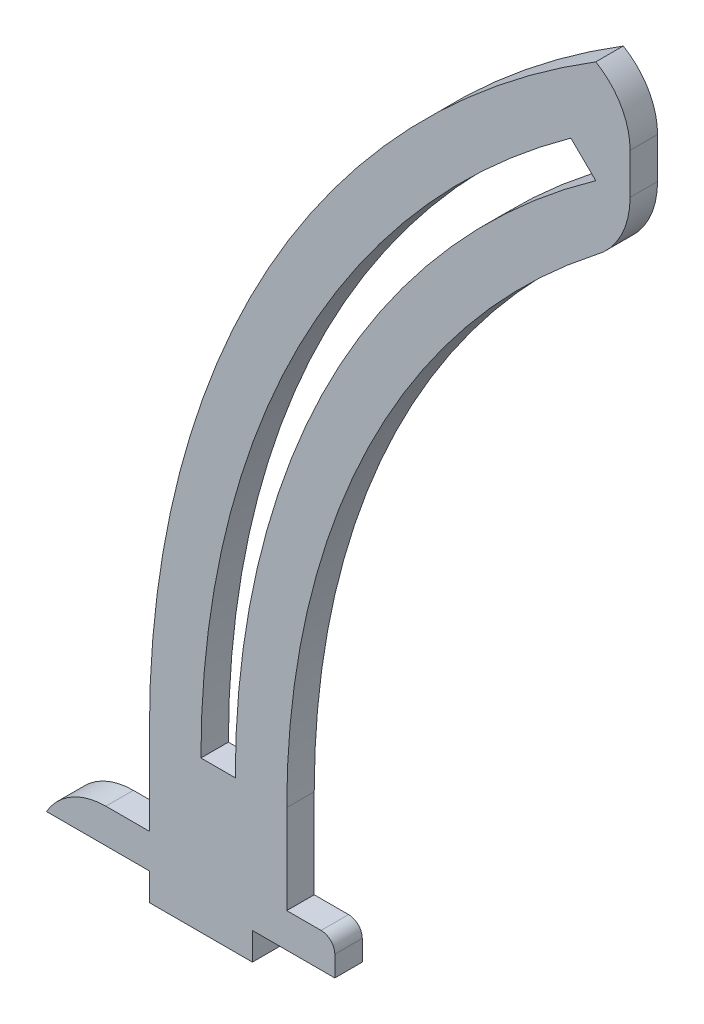
ISO-10303-21;
HEADER;
FILE_DESCRIPTION(('STEP AP214'),'2;1');
FILE_NAME('part.step','',(''),(''),'','','');
FILE_SCHEMA(('AUTOMOTIVE_DESIGN { 1 0 10303 214 1 1 1 1 }'));
ENDSEC;
DATA;
#1=APPLICATION_CONTEXT('core data for automotive mechanical design processes');
#2=APPLICATION_PROTOCOL_DEFINITION('international standard','automotive_design',2000,#1);
#3=PRODUCT_CONTEXT('',#1,'mechanical');
#4=PRODUCT('Part','Part','',(#3));
#5=PRODUCT_RELATED_PRODUCT_CATEGORY('part','',(#4));
#6=PRODUCT_DEFINITION_FORMATION('','',#4);
#7=PRODUCT_DEFINITION_CONTEXT('part definition',#1,'design');
#8=PRODUCT_DEFINITION('design','',#6,#7);
#9=PRODUCT_DEFINITION_SHAPE('','',#8);
#10=(LENGTH_UNIT() NAMED_UNIT(*) SI_UNIT(.MILLI.,.METRE.));
#11=(NAMED_UNIT(*) PLANE_ANGLE_UNIT() SI_UNIT($,.RADIAN.));
#12=(NAMED_UNIT(*) SI_UNIT($,.STERADIAN.) SOLID_ANGLE_UNIT());
#13=UNCERTAINTY_MEASURE_WITH_UNIT(LENGTH_MEASURE(1.E-05),#10,'distance_accuracy_value','');
#14=(GEOMETRIC_REPRESENTATION_CONTEXT(3) GLOBAL_UNCERTAINTY_ASSIGNED_CONTEXT((#13)) GLOBAL_UNIT_ASSIGNED_CONTEXT((#10,
#11,#12)) REPRESENTATION_CONTEXT('',''));
#15=CARTESIAN_POINT('',(0.,0.,0.));
#16=DIRECTION('',(0.,0.,1.));
#17=DIRECTION('',(1.,0.,0.));
#18=AXIS2_PLACEMENT_3D('',#15,#16,#17);
#19=CARTESIAN_POINT('',(0.,-22.86,0.));
#20=DIRECTION('',(0.,-1.,0.));
#21=DIRECTION('',(1.,0.,0.));
#22=AXIS2_PLACEMENT_3D('',#19,#20,#21);
#23=PLANE('',#22);
#24=DIRECTION('',(1.,0.,0.));
#25=VECTOR('',#24,1.);
#26=CARTESIAN_POINT('',(-173.99,-22.8600000000001,0.));
#27=LINE('',#26,#25);
#28=CARTESIAN_POINT('',(-193.04,-22.8600000000001,0.));
#29=VERTEX_POINT('',#28);
#30=CARTESIAN_POINT('',(-173.99,-22.8600000000001,0.));
#31=VERTEX_POINT('',#30);
#32=EDGE_CURVE('E263',#29,#31,#27,.T.);
#33=ORIENTED_EDGE('',*,*,#32,.T.);
#34=DIRECTION('',(0.,0.,-1.));
#35=VECTOR('',#34,1.);
#36=CARTESIAN_POINT('',(-173.99,-22.8600000000001,0.));
#37=LINE('',#36,#35);
#38=CARTESIAN_POINT('',(-173.99,-22.8600000000001,5.08));
#39=VERTEX_POINT('',#38);
#40=EDGE_CURVE('E197',#39,#31,#37,.T.);
#41=ORIENTED_EDGE('',*,*,#40,.F.);
#42=DIRECTION('',(-1.,0.,0.));
#43=VECTOR('',#42,1.);
#44=CARTESIAN_POINT('',(-173.99,-22.8600000000001,5.08));
#45=LINE('',#44,#43);
#46=CARTESIAN_POINT('',(-193.04,-22.8600000000001,5.08));
#47=VERTEX_POINT('',#46);
#48=EDGE_CURVE('E265',#39,#47,#45,.T.);
#49=ORIENTED_EDGE('',*,*,#48,.T.);
#50=DIRECTION('',(0.,0.,1.));
#51=VECTOR('',#50,1.);
#52=CARTESIAN_POINT('',(-193.04,-22.8600000000001,0.));
#53=LINE('',#52,#51);
#54=EDGE_CURVE('E229',#29,#47,#53,.T.);
#55=ORIENTED_EDGE('',*,*,#54,.F.);
#56=EDGE_LOOP('',(#33,#41,#49,#55));
#57=FACE_BOUND('',#56,.T.);
#58=ADVANCED_FACE('F32',(#57),#23,.T.);
#59=CARTESIAN_POINT('',(0.,0.,5.08));
#60=DIRECTION('',(0.,0.,-1.));
#61=DIRECTION('',(-1.,0.,0.));
#62=AXIS2_PLACEMENT_3D('',#59,#60,#61);
#63=CYLINDRICAL_SURFACE('',#62,173.99);
#64=CARTESIAN_POINT('',(0.,0.,5.08));
#65=DIRECTION('',(0.,0.,-1.));
#66=DIRECTION('',(-1.,0.,0.));
#67=AXIS2_PLACEMENT_3D('',#64,#65,#66);
#68=CIRCLE('',#67,173.99);
#69=CARTESIAN_POINT('',(-173.99,0.,5.08));
#70=VERTEX_POINT('',#69);
#71=CARTESIAN_POINT('',(-91.4322400010832,148.029272741523,5.08));
#72=VERTEX_POINT('',#71);
#73=EDGE_CURVE('E291',#70,#72,#68,.T.);
#74=ORIENTED_EDGE('',*,*,#73,.T.);
#75=DIRECTION('',(0.,0.,-1.));
#76=VECTOR('',#75,1.);
#77=CARTESIAN_POINT('',(-91.4322400010832,148.029272741523,5.08));
#78=LINE('',#77,#76);
#79=CARTESIAN_POINT('',(-91.4322400010832,148.029272741523,0.));
#80=VERTEX_POINT('',#79);
#81=EDGE_CURVE('E217',#72,#80,#78,.T.);
#82=ORIENTED_EDGE('',*,*,#81,.T.);
#83=CARTESIAN_POINT('',(0.,0.,0.));
#84=DIRECTION('',(0.,0.,-1.));
#85=DIRECTION('',(-1.,0.,0.));
#86=AXIS2_PLACEMENT_3D('',#83,#84,#85);
#87=CIRCLE('',#86,173.99);
#88=CARTESIAN_POINT('',(-173.99,0.,0.));
#89=VERTEX_POINT('',#88);
#90=EDGE_CURVE('E295',#89,#80,#87,.T.);
#91=ORIENTED_EDGE('',*,*,#90,.F.);
#92=DIRECTION('',(0.,0.,-1.));
#93=VECTOR('',#92,1.);
#94=CARTESIAN_POINT('',(-173.99,0.,5.08));
#95=LINE('',#94,#93);
#96=EDGE_CURVE('E294',#70,#89,#95,.T.);
#97=ORIENTED_EDGE('',*,*,#96,.F.);
#98=EDGE_LOOP('',(#74,#82,#91,#97));
#99=FACE_BOUND('',#98,.T.);
#100=ADVANCED_FACE('F370',(#99),#63,.T.);
#101=CARTESIAN_POINT('',(0.,0.,5.08));
#102=DIRECTION('',(0.,0.,1.));
#103=DIRECTION('',(1.,0.,0.));
#104=AXIS2_PLACEMENT_3D('',#101,#102,#103);
#105=PLANE('',#104);
#106=ORIENTED_EDGE('',*,*,#48,.F.);
#107=DIRECTION('',(0.,1.,0.));
#108=VECTOR('',#107,1.);
#109=CARTESIAN_POINT('',(-173.99,-27.9400000000001,5.08));
#110=LINE('',#109,#108);
#111=CARTESIAN_POINT('',(-173.99,-27.9400000000001,5.08));
#112=VERTEX_POINT('',#111);
#113=EDGE_CURVE('E193',#112,#39,#110,.T.);
#114=ORIENTED_EDGE('',*,*,#113,.F.);
#115=DIRECTION('',(-1.,0.,0.));
#116=VECTOR('',#115,1.);
#117=CARTESIAN_POINT('',(-167.64,-27.9400000000001,5.08));
#118=LINE('',#117,#116);
#119=CARTESIAN_POINT('',(-154.94,-27.9400000000001,5.08));
#120=VERTEX_POINT('',#119);
#121=EDGE_CURVE('E186',#120,#112,#118,.T.);
#122=ORIENTED_EDGE('',*,*,#121,.F.);
#123=DIRECTION('',(0.,1.,0.));
#124=VECTOR('',#123,1.);
#125=CARTESIAN_POINT('',(-154.94,-27.9400000000001,5.08));
#126=LINE('',#125,#124);
#127=CARTESIAN_POINT('',(-154.94,-22.8600000000001,5.08));
#128=VERTEX_POINT('',#127);
#129=EDGE_CURVE('E226',#120,#128,#126,.T.);
#130=ORIENTED_EDGE('',*,*,#129,.T.);
#131=CARTESIAN_POINT('',(-139.7,-22.8600000000001,5.08));
#132=VERTEX_POINT('',#131);
#133=EDGE_CURVE('E267',#132,#128,#45,.T.);
#134=ORIENTED_EDGE('',*,*,#133,.F.);
#135=DIRECTION('',(0.,1.,0.));
#136=VECTOR('',#135,1.);
#137=CARTESIAN_POINT('',(-139.7,-22.8600000000001,5.08));
#138=LINE('',#137,#136);
#139=CARTESIAN_POINT('',(-139.7,-19.0500000000001,5.08));
#140=VERTEX_POINT('',#139);
#141=EDGE_CURVE('E237',#132,#140,#138,.T.);
#142=ORIENTED_EDGE('',*,*,#141,.T.);
#143=CARTESIAN_POINT('',(-142.24,-19.0500000000001,5.08));
#144=DIRECTION('',(0.,0.,1.));
#145=DIRECTION('',(1.,0.,0.));
#146=AXIS2_PLACEMENT_3D('',#143,#144,#145);
#147=CIRCLE('',#146,2.54);
#148=CARTESIAN_POINT('',(-142.24,-16.5100000000001,5.08));
#149=VERTEX_POINT('',#148);
#150=EDGE_CURVE('E11',#140,#149,#147,.T.);
#151=ORIENTED_EDGE('',*,*,#150,.T.);
#152=DIRECTION('',(-1.,0.,0.));
#153=VECTOR('',#152,1.);
#154=CARTESIAN_POINT('',(-139.7,-16.5100000000001,5.08));
#155=LINE('',#154,#153);
#156=CARTESIAN_POINT('',(-148.59,-16.5100000000001,5.08));
#157=VERTEX_POINT('',#156);
#158=EDGE_CURVE('E244',#149,#157,#155,.T.);
#159=ORIENTED_EDGE('',*,*,#158,.T.);
#160=DIRECTION('',(0.,1.,0.));
#161=VECTOR('',#160,1.);
#162=CARTESIAN_POINT('',(-148.59,-22.8600000000001,5.08));
#163=LINE('',#162,#161);
#164=CARTESIAN_POINT('',(-148.59,-1.06452606712904E-13,5.08));
#165=VERTEX_POINT('',#164);
#166=EDGE_CURVE('E278',#157,#165,#163,.T.);
#167=ORIENTED_EDGE('',*,*,#166,.T.);
#168=CARTESIAN_POINT('',(0.,0.,5.08));
#169=DIRECTION('',(0.,0.,1.));
#170=DIRECTION('',(1.,0.,0.));
#171=AXIS2_PLACEMENT_3D('',#168,#169,#170);
#172=CIRCLE('',#171,148.59);
#173=CARTESIAN_POINT('',(-91.4322400010832,117.128705227986,5.08));
#174=VERTEX_POINT('',#173);
#175=EDGE_CURVE('E251',#165,#174,#172,.F.);
#176=ORIENTED_EDGE('',*,*,#175,.T.);
#177=CARTESIAN_POINT('',(-100.322240001083,129.507134045893,5.08));
#178=DIRECTION('',(0.,0.,1.));
#179=DIRECTION('',(1.,0.,0.));
#180=AXIS2_PLACEMENT_3D('',#177,#178,#179);
#181=CIRCLE('',#180,15.24);
#182=CARTESIAN_POINT('',(-85.0822400010832,129.507134045893,5.08));
#183=VERTEX_POINT('',#182);
#184=EDGE_CURVE('E312',#174,#183,#181,.T.);
#185=ORIENTED_EDGE('',*,*,#184,.T.);
#186=DIRECTION('',(0.,-1.,0.));
#187=VECTOR('',#186,1.);
#188=CARTESIAN_POINT('',(-85.0822400010832,148.029272741523,5.08));
#189=LINE('',#188,#187);
#190=CARTESIAN_POINT('',(-85.0822400010832,137.030750113461,5.08));
#191=VERTEX_POINT('',#190);
#192=EDGE_CURVE('E209',#191,#183,#189,.T.);
#193=ORIENTED_EDGE('',*,*,#192,.F.);
#194=CARTESIAN_POINT('',(-97.7822400010832,137.030750113461,5.08));
#195=DIRECTION('',(0.,0.,1.));
#196=DIRECTION('',(1.,0.,0.));
#197=AXIS2_PLACEMENT_3D('',#194,#195,#196);
#198=CIRCLE('',#197,12.7);
#199=EDGE_CURVE('E318',#191,#72,#198,.T.);
#200=ORIENTED_EDGE('',*,*,#199,.T.);
#201=ORIENTED_EDGE('',*,*,#73,.F.);
#202=DIRECTION('',(0.,1.,0.));
#203=VECTOR('',#202,1.);
#204=CARTESIAN_POINT('',(-173.99,-22.8600000000001,5.08));
#205=LINE('',#204,#203);
#206=CARTESIAN_POINT('',(-173.99,-16.5100000000001,5.08));
#207=VERTEX_POINT('',#206);
#208=EDGE_CURVE('E269',#207,#70,#205,.T.);
#209=ORIENTED_EDGE('',*,*,#208,.F.);
#210=CARTESIAN_POINT('',(-182.041477371938,-16.5100000000001,5.08));
#211=VERTEX_POINT('',#210);
#212=EDGE_CURVE('E239',#207,#211,#155,.T.);
#213=ORIENTED_EDGE('',*,*,#212,.T.);
#214=CARTESIAN_POINT('',(-182.041477371938,-29.2100000000001,5.08));
#215=DIRECTION('',(0.,0.,1.));
#216=DIRECTION('',(1.,0.,0.));
#217=AXIS2_PLACEMENT_3D('',#214,#215,#216);
#218=CIRCLE('',#217,12.7);
#219=EDGE_CURVE('E326',#211,#47,#218,.T.);
#220=ORIENTED_EDGE('',*,*,#219,.T.);
#221=EDGE_LOOP('',(#106,#114,#122,#130,#134,#142,#151,#159,#167,#176,#185,#193,#200,#201,#209,
#213,#220));
#222=FACE_BOUND('',#221,.T.);
#223=DIRECTION('',(-0.714798052741385,0.699330925812039,0.));
#224=VECTOR('',#223,1.);
#225=CARTESIAN_POINT('',(-91.4322400010832,128.998057013989,5.08));
#226=LINE('',#225,#224);
#227=CARTESIAN_POINT('',(-91.4322400010832,128.998057013989,5.08));
#228=VERTEX_POINT('',#227);
#229=CARTESIAN_POINT('',(-96.0425867651607,133.508642987848,5.08));
#230=VERTEX_POINT('',#229);
#231=EDGE_CURVE('E203',#228,#230,#226,.T.);
#232=ORIENTED_EDGE('',*,*,#231,.F.);
#233=CARTESIAN_POINT('',(0.,0.,5.08));
#234=DIRECTION('',(0.,0.,1.));
#235=DIRECTION('',(1.,0.,0.));
#236=AXIS2_PLACEMENT_3D('',#233,#234,#235);
#237=CIRCLE('',#236,158.115);
#238=CARTESIAN_POINT('',(-158.115,0.,5.08));
#239=VERTEX_POINT('',#238);
#240=EDGE_CURVE('E258',#239,#228,#237,.F.);
#241=ORIENTED_EDGE('',*,*,#240,.F.);
#242=DIRECTION('',(-1.,0.,0.));
#243=VECTOR('',#242,1.);
#244=CARTESIAN_POINT('',(-173.99,-1.24649633501434E-13,5.08));
#245=LINE('',#244,#243);
#246=CARTESIAN_POINT('',(-164.465,-1.17825748455735E-13,5.08));
#247=VERTEX_POINT('',#246);
#248=EDGE_CURVE('E275',#239,#247,#245,.T.);
#249=ORIENTED_EDGE('',*,*,#248,.T.);
#250=CARTESIAN_POINT('',(0.,0.,5.08));
#251=DIRECTION('',(0.,0.,1.));
#252=DIRECTION('',(1.,0.,0.));
#253=AXIS2_PLACEMENT_3D('',#250,#251,#252);
#254=CIRCLE('',#253,164.465);
#255=EDGE_CURVE('E290',#247,#230,#254,.F.);
#256=ORIENTED_EDGE('',*,*,#255,.T.);
#257=EDGE_LOOP('',(#232,#241,#249,#256));
#258=FACE_BOUND('',#257,.T.);
#259=ADVANCED_FACE('F351',(#222,#258),#105,.T.);
#260=CARTESIAN_POINT('',(0.,0.,0.));
#261=DIRECTION('',(0.,0.,1.));
#262=DIRECTION('',(1.,0.,0.));
#263=AXIS2_PLACEMENT_3D('',#260,#261,#262);
#264=PLANE('',#263);
#265=CARTESIAN_POINT('',(0.,0.,0.));
#266=DIRECTION('',(0.,0.,1.));
#267=DIRECTION('',(1.,0.,0.));
#268=AXIS2_PLACEMENT_3D('',#265,#266,#267);
#269=CIRCLE('',#268,158.115);
#270=CARTESIAN_POINT('',(-158.115,0.,0.));
#271=VERTEX_POINT('',#270);
#272=CARTESIAN_POINT('',(-91.4322400010832,128.998057013989,0.));
#273=VERTEX_POINT('',#272);
#274=EDGE_CURVE('E254',#271,#273,#269,.F.);
#275=ORIENTED_EDGE('',*,*,#274,.T.);
#276=DIRECTION('',(-0.714798052741385,0.699330925812039,0.));
#277=VECTOR('',#276,1.);
#278=CARTESIAN_POINT('',(-91.4322400010832,128.998057013989,0.));
#279=LINE('',#278,#277);
#280=CARTESIAN_POINT('',(-96.0425867651607,133.508642987848,0.));
#281=VERTEX_POINT('',#280);
#282=EDGE_CURVE('E202',#273,#281,#279,.T.);
#283=ORIENTED_EDGE('',*,*,#282,.T.);
#284=CARTESIAN_POINT('',(0.,0.,0.));
#285=DIRECTION('',(0.,0.,-1.));
#286=DIRECTION('',(-1.,0.,0.));
#287=AXIS2_PLACEMENT_3D('',#284,#285,#286);
#288=CIRCLE('',#287,164.465);
#289=CARTESIAN_POINT('',(-164.465,0.,0.));
#290=VERTEX_POINT('',#289);
#291=EDGE_CURVE('E284',#290,#281,#288,.T.);
#292=ORIENTED_EDGE('',*,*,#291,.F.);
#293=DIRECTION('',(1.,0.,0.));
#294=VECTOR('',#293,1.);
#295=CARTESIAN_POINT('',(-173.99,-1.24649633501434E-13,0.));
#296=LINE('',#295,#294);
#297=EDGE_CURVE('E257',#290,#271,#296,.T.);
#298=ORIENTED_EDGE('',*,*,#297,.T.);
#299=EDGE_LOOP('',(#275,#283,#292,#298));
#300=FACE_BOUND('',#299,.T.);
#301=DIRECTION('',(-1.,0.,0.));
#302=VECTOR('',#301,1.);
#303=CARTESIAN_POINT('',(-139.7,-16.5100000000001,0.));
#304=LINE('',#303,#302);
#305=CARTESIAN_POINT('',(-142.24,-16.5100000000001,0.));
#306=VERTEX_POINT('',#305);
#307=CARTESIAN_POINT('',(-148.59,-16.5100000000001,0.));
#308=VERTEX_POINT('',#307);
#309=EDGE_CURVE('E240',#306,#308,#304,.T.);
#310=ORIENTED_EDGE('',*,*,#309,.F.);
#311=CARTESIAN_POINT('',(-142.24,-19.0500000000001,0.));
#312=DIRECTION('',(0.,0.,1.));
#313=DIRECTION('',(1.,0.,0.));
#314=AXIS2_PLACEMENT_3D('',#311,#312,#313);
#315=CIRCLE('',#314,2.54);
#316=CARTESIAN_POINT('',(-139.7,-19.0500000000001,0.));
#317=VERTEX_POINT('',#316);
#318=EDGE_CURVE('E54',#306,#317,#315,.F.);
#319=ORIENTED_EDGE('',*,*,#318,.T.);
#320=DIRECTION('',(0.,-1.,0.));
#321=VECTOR('',#320,1.);
#322=CARTESIAN_POINT('',(-139.7,-22.8600000000001,0.));
#323=LINE('',#322,#321);
#324=CARTESIAN_POINT('',(-139.7,-22.8600000000001,0.));
#325=VERTEX_POINT('',#324);
#326=EDGE_CURVE('E232',#317,#325,#323,.T.);
#327=ORIENTED_EDGE('',*,*,#326,.T.);
#328=CARTESIAN_POINT('',(-154.94,-22.8600000000001,0.));
#329=VERTEX_POINT('',#328);
#330=EDGE_CURVE('E266',#329,#325,#27,.T.);
#331=ORIENTED_EDGE('',*,*,#330,.F.);
#332=DIRECTION('',(0.,1.,0.));
#333=VECTOR('',#332,1.);
#334=CARTESIAN_POINT('',(-154.94,-27.9400000000001,0.));
#335=LINE('',#334,#333);
#336=CARTESIAN_POINT('',(-154.94,-27.9400000000001,0.));
#337=VERTEX_POINT('',#336);
#338=EDGE_CURVE('E182',#337,#329,#335,.T.);
#339=ORIENTED_EDGE('',*,*,#338,.F.);
#340=DIRECTION('',(1.,0.,0.));
#341=VECTOR('',#340,1.);
#342=CARTESIAN_POINT('',(-167.64,-27.9400000000001,0.));
#343=LINE('',#342,#341);
#344=CARTESIAN_POINT('',(-173.99,-27.9400000000001,0.));
#345=VERTEX_POINT('',#344);
#346=EDGE_CURVE('E173',#345,#337,#343,.T.);
#347=ORIENTED_EDGE('',*,*,#346,.F.);
#348=DIRECTION('',(0.,-1.,0.));
#349=VECTOR('',#348,1.);
#350=CARTESIAN_POINT('',(-173.99,-27.9400000000001,0.));
#351=LINE('',#350,#349);
#352=EDGE_CURVE('E178',#31,#345,#351,.T.);
#353=ORIENTED_EDGE('',*,*,#352,.F.);
#354=ORIENTED_EDGE('',*,*,#32,.F.);
#355=CARTESIAN_POINT('',(-182.041477371938,-29.2100000000001,0.));
#356=DIRECTION('',(0.,0.,1.));
#357=DIRECTION('',(1.,0.,0.));
#358=AXIS2_PLACEMENT_3D('',#355,#356,#357);
#359=CIRCLE('',#358,12.7);
#360=CARTESIAN_POINT('',(-182.041477371938,-16.5100000000001,0.));
#361=VERTEX_POINT('',#360);
#362=EDGE_CURVE('E322',#29,#361,#359,.F.);
#363=ORIENTED_EDGE('',*,*,#362,.T.);
#364=CARTESIAN_POINT('',(-173.99,-16.5100000000001,0.));
#365=VERTEX_POINT('',#364);
#366=EDGE_CURVE('E243',#365,#361,#304,.T.);
#367=ORIENTED_EDGE('',*,*,#366,.F.);
#368=DIRECTION('',(0.,1.,0.));
#369=VECTOR('',#368,1.);
#370=CARTESIAN_POINT('',(-173.99,-22.8600000000001,0.));
#371=LINE('',#370,#369);
#372=EDGE_CURVE('E282',#365,#89,#371,.T.);
#373=ORIENTED_EDGE('',*,*,#372,.T.);
#374=ORIENTED_EDGE('',*,*,#90,.T.);
#375=CARTESIAN_POINT('',(-97.7822400010832,137.030750113461,0.));
#376=DIRECTION('',(0.,0.,1.));
#377=DIRECTION('',(1.,0.,0.));
#378=AXIS2_PLACEMENT_3D('',#375,#376,#377);
#379=CIRCLE('',#378,12.7);
#380=CARTESIAN_POINT('',(-85.0822400010832,137.030750113461,0.));
#381=VERTEX_POINT('',#380);
#382=EDGE_CURVE('E320',#80,#381,#379,.F.);
#383=ORIENTED_EDGE('',*,*,#382,.T.);
#384=DIRECTION('',(0.,1.,0.));
#385=VECTOR('',#384,1.);
#386=CARTESIAN_POINT('',(-85.0822400010832,148.029272741523,0.));
#387=LINE('',#386,#385);
#388=CARTESIAN_POINT('',(-85.0822400010832,129.507134045893,0.));
#389=VERTEX_POINT('',#388);
#390=EDGE_CURVE('E211',#389,#381,#387,.T.);
#391=ORIENTED_EDGE('',*,*,#390,.F.);
#392=CARTESIAN_POINT('',(-100.322240001083,129.507134045893,0.));
#393=DIRECTION('',(0.,0.,1.));
#394=DIRECTION('',(1.,0.,0.));
#395=AXIS2_PLACEMENT_3D('',#392,#393,#394);
#396=CIRCLE('',#395,15.24);
#397=CARTESIAN_POINT('',(-91.4322400010832,117.128705227986,0.));
#398=VERTEX_POINT('',#397);
#399=EDGE_CURVE('E310',#389,#398,#396,.F.);
#400=ORIENTED_EDGE('',*,*,#399,.T.);
#401=CARTESIAN_POINT('',(0.,0.,0.));
#402=DIRECTION('',(0.,0.,1.));
#403=DIRECTION('',(1.,0.,0.));
#404=AXIS2_PLACEMENT_3D('',#401,#402,#403);
#405=CIRCLE('',#404,148.59);
#406=CARTESIAN_POINT('',(-148.59,0.,0.));
#407=VERTEX_POINT('',#406);
#408=EDGE_CURVE('E248',#407,#398,#405,.F.);
#409=ORIENTED_EDGE('',*,*,#408,.F.);
#410=DIRECTION('',(0.,1.,0.));
#411=VECTOR('',#410,1.);
#412=CARTESIAN_POINT('',(-148.59,-22.8600000000001,0.));
#413=LINE('',#412,#411);
#414=EDGE_CURVE('E280',#308,#407,#413,.T.);
#415=ORIENTED_EDGE('',*,*,#414,.F.);
#416=EDGE_LOOP('',(#310,#319,#327,#331,#339,#347,#353,#354,#363,#367,#373,#374,#383,#391,#400,
#409,#415));
#417=FACE_BOUND('',#416,.T.);
#418=ADVANCED_FACE('F175',(#300,#417),#264,.F.);
#419=CARTESIAN_POINT('',(0.,0.,0.));
#420=DIRECTION('',(0.,0.,1.));
#421=DIRECTION('',(1.,0.,0.));
#422=AXIS2_PLACEMENT_3D('',#419,#420,#421);
#423=CYLINDRICAL_SURFACE('',#422,164.465);
#424=DIRECTION('',(0.,0.,-1.));
#425=VECTOR('',#424,1.);
#426=CARTESIAN_POINT('',(-96.0425867651607,133.508642987848,5.08));
#427=LINE('',#426,#425);
#428=EDGE_CURVE('E205',#230,#281,#427,.T.);
#429=ORIENTED_EDGE('',*,*,#428,.F.);
#430=ORIENTED_EDGE('',*,*,#255,.F.);
#431=DIRECTION('',(0.,0.,1.));
#432=VECTOR('',#431,1.);
#433=CARTESIAN_POINT('',(-164.465,0.,0.));
#434=LINE('',#433,#432);
#435=EDGE_CURVE('E287',#290,#247,#434,.T.);
#436=ORIENTED_EDGE('',*,*,#435,.F.);
#437=ORIENTED_EDGE('',*,*,#291,.T.);
#438=EDGE_LOOP('',(#429,#430,#436,#437));
#439=FACE_BOUND('',#438,.T.);
#440=ADVANCED_FACE('F418',(#439),#423,.F.);
#441=CARTESIAN_POINT('',(0.,0.,5.08));
#442=DIRECTION('',(0.,0.,-1.));
#443=DIRECTION('',(-1.,0.,0.));
#444=AXIS2_PLACEMENT_3D('',#441,#442,#443);
#445=CYLINDRICAL_SURFACE('',#444,148.59);
#446=DIRECTION('',(0.,0.,-1.));
#447=VECTOR('',#446,1.);
#448=CARTESIAN_POINT('',(-91.4322400010832,117.128705227986,5.08));
#449=LINE('',#448,#447);
#450=EDGE_CURVE('E214',#174,#398,#449,.T.);
#451=ORIENTED_EDGE('',*,*,#450,.F.);
#452=ORIENTED_EDGE('',*,*,#175,.F.);
#453=DIRECTION('',(0.,0.,1.));
#454=VECTOR('',#453,1.);
#455=CARTESIAN_POINT('',(-148.59,-1.06452606712904E-13,5.08));
#456=LINE('',#455,#454);
#457=EDGE_CURVE('E272',#407,#165,#456,.T.);
#458=ORIENTED_EDGE('',*,*,#457,.F.);
#459=ORIENTED_EDGE('',*,*,#408,.T.);
#460=EDGE_LOOP('',(#451,#452,#458,#459));
#461=FACE_BOUND('',#460,.T.);
#462=ADVANCED_FACE('F347',(#461),#445,.F.);
#463=CARTESIAN_POINT('',(0.,0.,0.));
#464=DIRECTION('',(0.,0.,1.));
#465=DIRECTION('',(1.,0.,0.));
#466=AXIS2_PLACEMENT_3D('',#463,#464,#465);
#467=CYLINDRICAL_SURFACE('',#466,158.115);
#468=DIRECTION('',(0.,0.,1.));
#469=VECTOR('',#468,1.);
#470=CARTESIAN_POINT('',(-91.4322400010832,128.998057013989,0.));
#471=LINE('',#470,#469);
#472=EDGE_CURVE('E305',#273,#228,#471,.T.);
#473=ORIENTED_EDGE('',*,*,#472,.F.);
#474=ORIENTED_EDGE('',*,*,#274,.F.);
#475=DIRECTION('',(0.,0.,1.));
#476=VECTOR('',#475,1.);
#477=CARTESIAN_POINT('',(-158.115,0.,0.));
#478=LINE('',#477,#476);
#479=EDGE_CURVE('E255',#271,#239,#478,.T.);
#480=ORIENTED_EDGE('',*,*,#479,.T.);
#481=ORIENTED_EDGE('',*,*,#240,.T.);
#482=EDGE_LOOP('',(#473,#474,#480,#481));
#483=FACE_BOUND('',#482,.T.);
#484=ADVANCED_FACE('F408',(#483),#467,.T.);
#485=DIRECTION('',(0.,0.,1.));
#486=VECTOR('',#485,1.);
#487=CARTESIAN_POINT('',(-154.94,-22.8600000000001,0.));
#488=LINE('',#487,#486);
#489=EDGE_CURVE('E219',#329,#128,#488,.T.);
#490=ORIENTED_EDGE('',*,*,#489,.F.);
#491=ORIENTED_EDGE('',*,*,#330,.T.);
#492=DIRECTION('',(0.,0.,1.));
#493=VECTOR('',#492,1.);
#494=CARTESIAN_POINT('',(-139.7,-22.8600000000001,0.));
#495=LINE('',#494,#493);
#496=EDGE_CURVE('E234',#325,#132,#495,.T.);
#497=ORIENTED_EDGE('',*,*,#496,.T.);
#498=ORIENTED_EDGE('',*,*,#133,.T.);
#499=EDGE_LOOP('',(#490,#491,#497,#498));
#500=FACE_BOUND('',#499,.T.);
#501=ADVANCED_FACE('F387',(#500),#23,.T.);
#502=CARTESIAN_POINT('',(0.,0.,0.));
#503=DIRECTION('',(0.,-1.,0.));
#504=DIRECTION('',(1.,0.,0.));
#505=AXIS2_PLACEMENT_3D('',#502,#503,#504);
#506=PLANE('',#505);
#507=ORIENTED_EDGE('',*,*,#479,.F.);
#508=ORIENTED_EDGE('',*,*,#297,.F.);
#509=ORIENTED_EDGE('',*,*,#435,.T.);
#510=ORIENTED_EDGE('',*,*,#248,.F.);
#511=EDGE_LOOP('',(#507,#508,#509,#510));
#512=FACE_BOUND('',#511,.T.);
#513=ADVANCED_FACE('F407',(#512),#506,.F.);
#514=CARTESIAN_POINT('',(-173.99,-22.8600000000001,5.08));
#515=DIRECTION('',(1.,0.,0.));
#516=DIRECTION('',(0.,1.,0.));
#517=AXIS2_PLACEMENT_3D('',#514,#515,#516);
#518=PLANE('',#517);
#519=ORIENTED_EDGE('',*,*,#372,.F.);
#520=DIRECTION('',(0.,0.,1.));
#521=VECTOR('',#520,1.);
#522=CARTESIAN_POINT('',(-173.99,-16.5100000000001,5.08));
#523=LINE('',#522,#521);
#524=EDGE_CURVE('E242',#365,#207,#523,.T.);
#525=ORIENTED_EDGE('',*,*,#524,.T.);
#526=ORIENTED_EDGE('',*,*,#208,.T.);
#527=ORIENTED_EDGE('',*,*,#96,.T.);
#528=EDGE_LOOP('',(#519,#525,#526,#527));
#529=FACE_BOUND('',#528,.T.);
#530=ADVANCED_FACE('F373',(#529),#518,.F.);
#531=CARTESIAN_POINT('',(-148.59,-22.8600000000001,5.08));
#532=DIRECTION('',(-1.,0.,0.));
#533=DIRECTION('',(0.,-1.,0.));
#534=AXIS2_PLACEMENT_3D('',#531,#532,#533);
#535=PLANE('',#534);
#536=ORIENTED_EDGE('',*,*,#166,.F.);
#537=DIRECTION('',(0.,0.,-1.));
#538=VECTOR('',#537,1.);
#539=CARTESIAN_POINT('',(-148.59,-16.5100000000001,5.08));
#540=LINE('',#539,#538);
#541=EDGE_CURVE('E300',#157,#308,#540,.T.);
#542=ORIENTED_EDGE('',*,*,#541,.T.);
#543=ORIENTED_EDGE('',*,*,#414,.T.);
#544=ORIENTED_EDGE('',*,*,#457,.T.);
#545=EDGE_LOOP('',(#536,#542,#543,#544));
#546=FACE_BOUND('',#545,.T.);
#547=ADVANCED_FACE('F344',(#546),#535,.F.);
#548=CARTESIAN_POINT('',(-139.7,-7.35936785703716E-13,0.));
#549=DIRECTION('',(1.,0.,0.));
#550=DIRECTION('',(0.,1.,0.));
#551=AXIS2_PLACEMENT_3D('',#548,#549,#550);
#552=PLANE('',#551);
#553=ORIENTED_EDGE('',*,*,#326,.F.);
#554=DIRECTION('',(0.,0.,-1.));
#555=VECTOR('',#554,1.);
#556=CARTESIAN_POINT('',(-139.7,-19.0500000000001,0.));
#557=LINE('',#556,#555);
#558=EDGE_CURVE('E40',#317,#140,#557,.F.);
#559=ORIENTED_EDGE('',*,*,#558,.T.);
#560=ORIENTED_EDGE('',*,*,#141,.F.);
#561=ORIENTED_EDGE('',*,*,#496,.F.);
#562=EDGE_LOOP('',(#553,#559,#560,#561));
#563=FACE_BOUND('',#562,.T.);
#564=ADVANCED_FACE('F389',(#563),#552,.T.);
#565=CARTESIAN_POINT('',(-139.7,-16.5100000000001,0.));
#566=DIRECTION('',(0.,1.,0.));
#567=DIRECTION('',(-1.,0.,0.));
#568=AXIS2_PLACEMENT_3D('',#565,#566,#567);
#569=PLANE('',#568);
#570=ORIENTED_EDGE('',*,*,#158,.F.);
#571=DIRECTION('',(0.,0.,-1.));
#572=VECTOR('',#571,1.);
#573=CARTESIAN_POINT('',(-142.24,-16.5100000000001,0.));
#574=LINE('',#573,#572);
#575=EDGE_CURVE('E329',#149,#306,#574,.T.);
#576=ORIENTED_EDGE('',*,*,#575,.T.);
#577=ORIENTED_EDGE('',*,*,#309,.T.);
#578=ORIENTED_EDGE('',*,*,#541,.F.);
#579=EDGE_LOOP('',(#570,#576,#577,#578));
#580=FACE_BOUND('',#579,.T.);
#581=ADVANCED_FACE('F335',(#580),#569,.T.);
#582=ORIENTED_EDGE('',*,*,#366,.T.);
#583=DIRECTION('',(0.,0.,1.));
#584=VECTOR('',#583,1.);
#585=CARTESIAN_POINT('',(-182.041477371938,-16.5100000000001,5.08));
#586=LINE('',#585,#584);
#587=EDGE_CURVE('E324',#361,#211,#586,.T.);
#588=ORIENTED_EDGE('',*,*,#587,.T.);
#589=ORIENTED_EDGE('',*,*,#212,.F.);
#590=ORIENTED_EDGE('',*,*,#524,.F.);
#591=EDGE_LOOP('',(#582,#588,#589,#590));
#592=FACE_BOUND('',#591,.T.);
#593=ADVANCED_FACE('F422',(#592),#569,.T.);
#594=CARTESIAN_POINT('',(-154.94,-27.9400000000001,0.));
#595=DIRECTION('',(-1.,0.,0.));
#596=DIRECTION('',(0.,-1.,0.));
#597=AXIS2_PLACEMENT_3D('',#594,#595,#596);
#598=PLANE('',#597);
#599=ORIENTED_EDGE('',*,*,#489,.T.);
#600=ORIENTED_EDGE('',*,*,#129,.F.);
#601=DIRECTION('',(0.,0.,1.));
#602=VECTOR('',#601,1.);
#603=CARTESIAN_POINT('',(-154.94,-27.9400000000001,0.));
#604=LINE('',#603,#602);
#605=EDGE_CURVE('E220',#337,#120,#604,.T.);
#606=ORIENTED_EDGE('',*,*,#605,.F.);
#607=ORIENTED_EDGE('',*,*,#338,.T.);
#608=EDGE_LOOP('',(#599,#600,#606,#607));
#609=FACE_BOUND('',#608,.T.);
#610=ADVANCED_FACE('F384',(#609),#598,.F.);
#611=CARTESIAN_POINT('',(0.,-27.94,0.));
#612=DIRECTION('',(0.,1.,0.));
#613=DIRECTION('',(-1.,0.,0.));
#614=AXIS2_PLACEMENT_3D('',#611,#612,#613);
#615=PLANE('',#614);
#616=ORIENTED_EDGE('',*,*,#605,.T.);
#617=ORIENTED_EDGE('',*,*,#121,.T.);
#618=DIRECTION('',(0.,0.,1.));
#619=VECTOR('',#618,1.);
#620=CARTESIAN_POINT('',(-173.99,-27.9400000000001,0.));
#621=LINE('',#620,#619);
#622=EDGE_CURVE('E189',#345,#112,#621,.T.);
#623=ORIENTED_EDGE('',*,*,#622,.F.);
#624=ORIENTED_EDGE('',*,*,#346,.T.);
#625=EDGE_LOOP('',(#616,#617,#623,#624));
#626=FACE_BOUND('',#625,.T.);
#627=ADVANCED_FACE('F190',(#626),#615,.F.);
#628=CARTESIAN_POINT('',(-85.0822400010832,0.,0.));
#629=DIRECTION('',(1.,0.,0.));
#630=DIRECTION('',(0.,0.,-1.));
#631=AXIS2_PLACEMENT_3D('',#628,#629,#630);
#632=PLANE('',#631);
#633=ORIENTED_EDGE('',*,*,#390,.T.);
#634=DIRECTION('',(0.,0.,1.));
#635=VECTOR('',#634,1.);
#636=CARTESIAN_POINT('',(-85.0822400010832,137.030750113461,5.08));
#637=LINE('',#636,#635);
#638=EDGE_CURVE('E315',#381,#191,#637,.T.);
#639=ORIENTED_EDGE('',*,*,#638,.T.);
#640=ORIENTED_EDGE('',*,*,#192,.T.);
#641=DIRECTION('',(0.,0.,1.));
#642=VECTOR('',#641,1.);
#643=CARTESIAN_POINT('',(-85.0822400010832,129.507134045893,0.));
#644=LINE('',#643,#642);
#645=EDGE_CURVE('E307',#183,#389,#644,.F.);
#646=ORIENTED_EDGE('',*,*,#645,.T.);
#647=EDGE_LOOP('',(#633,#639,#640,#646));
#648=FACE_BOUND('',#647,.T.);
#649=ADVANCED_FACE('F359',(#648),#632,.T.);
#650=CARTESIAN_POINT('',(-100.322240001083,129.507134045893,5.08));
#651=DIRECTION('',(0.,0.,-1.));
#652=DIRECTION('',(-1.,0.,0.));
#653=AXIS2_PLACEMENT_3D('',#650,#651,#652);
#654=CYLINDRICAL_SURFACE('',#653,15.24);
#655=ORIENTED_EDGE('',*,*,#184,.F.);
#656=ORIENTED_EDGE('',*,*,#450,.T.);
#657=ORIENTED_EDGE('',*,*,#399,.F.);
#658=ORIENTED_EDGE('',*,*,#645,.F.);
#659=EDGE_LOOP('',(#655,#656,#657,#658));
#660=FACE_BOUND('',#659,.T.);
#661=ADVANCED_FACE('F356',(#660),#654,.T.);
#662=CARTESIAN_POINT('',(-97.7822400010832,137.030750113461,5.08));
#663=DIRECTION('',(0.,0.,-1.));
#664=DIRECTION('',(-1.,0.,0.));
#665=AXIS2_PLACEMENT_3D('',#662,#663,#664);
#666=CYLINDRICAL_SURFACE('',#665,12.7);
#667=ORIENTED_EDGE('',*,*,#382,.F.);
#668=ORIENTED_EDGE('',*,*,#81,.F.);
#669=ORIENTED_EDGE('',*,*,#199,.F.);
#670=ORIENTED_EDGE('',*,*,#638,.F.);
#671=EDGE_LOOP('',(#667,#668,#669,#670));
#672=FACE_BOUND('',#671,.T.);
#673=ADVANCED_FACE('F365',(#672),#666,.T.);
#674=CARTESIAN_POINT('',(-182.041477371938,-29.2100000000001,0.));
#675=DIRECTION('',(0.,0.,-1.));
#676=DIRECTION('',(-1.,0.,0.));
#677=AXIS2_PLACEMENT_3D('',#674,#675,#676);
#678=CYLINDRICAL_SURFACE('',#677,12.7);
#679=ORIENTED_EDGE('',*,*,#219,.F.);
#680=ORIENTED_EDGE('',*,*,#587,.F.);
#681=ORIENTED_EDGE('',*,*,#362,.F.);
#682=ORIENTED_EDGE('',*,*,#54,.T.);
#683=EDGE_LOOP('',(#679,#680,#681,#682));
#684=FACE_BOUND('',#683,.T.);
#685=ADVANCED_FACE('F379',(#684),#678,.T.);
#686=CARTESIAN_POINT('',(-142.24,-19.0500000000001,0.));
#687=DIRECTION('',(0.,0.,-1.));
#688=DIRECTION('',(-1.,0.,0.));
#689=AXIS2_PLACEMENT_3D('',#686,#687,#688);
#690=CYLINDRICAL_SURFACE('',#689,2.54);
#691=ORIENTED_EDGE('',*,*,#150,.F.);
#692=ORIENTED_EDGE('',*,*,#558,.F.);
#693=ORIENTED_EDGE('',*,*,#318,.F.);
#694=ORIENTED_EDGE('',*,*,#575,.F.);
#695=EDGE_LOOP('',(#691,#692,#693,#694));
#696=FACE_BOUND('',#695,.T.);
#697=ADVANCED_FACE('F34',(#696),#690,.T.);
#698=CARTESIAN_POINT('',(-91.4322400010832,128.998057013989,5.08));
#699=DIRECTION('',(-0.699330925812039,-0.714798052741385,0.));
#700=DIRECTION('',(0.714798052741386,-0.699330925812039,0.));
#701=AXIS2_PLACEMENT_3D('',#698,#699,#700);
#702=PLANE('',#701);
#703=ORIENTED_EDGE('',*,*,#282,.F.);
#704=ORIENTED_EDGE('',*,*,#472,.T.);
#705=ORIENTED_EDGE('',*,*,#231,.T.);
#706=ORIENTED_EDGE('',*,*,#428,.T.);
#707=EDGE_LOOP('',(#703,#704,#705,#706));
#708=FACE_BOUND('',#707,.T.);
#709=ADVANCED_FACE('F391',(#708),#702,.T.);
#710=CARTESIAN_POINT('',(-173.99,0.,0.));
#711=DIRECTION('',(1.,0.,0.));
#712=DIRECTION('',(0.,0.,-1.));
#713=AXIS2_PLACEMENT_3D('',#710,#711,#712);
#714=PLANE('',#713);
#715=ORIENTED_EDGE('',*,*,#352,.T.);
#716=ORIENTED_EDGE('',*,*,#622,.T.);
#717=ORIENTED_EDGE('',*,*,#113,.T.);
#718=ORIENTED_EDGE('',*,*,#40,.T.);
#719=EDGE_LOOP('',(#715,#716,#717,#718));
#720=FACE_BOUND('',#719,.T.);
#721=ADVANCED_FACE('F195',(#720),#714,.F.);
#722=CLOSED_SHELL('',(#58,#100,#259,#418,#440,#462,#484,#501,#513,#530,#547,#564,#581,#593,#610,
#627,#649,#661,#673,#685,#697,#709,#721));
#723=MANIFOLD_SOLID_BREP('B2',#722);
#724=ADVANCED_BREP_SHAPE_REPRESENTATION('',(#18,#723),#14);
#725=SHAPE_DEFINITION_REPRESENTATION(#9,#724);
ENDSEC;
END-ISO-10303-21;
